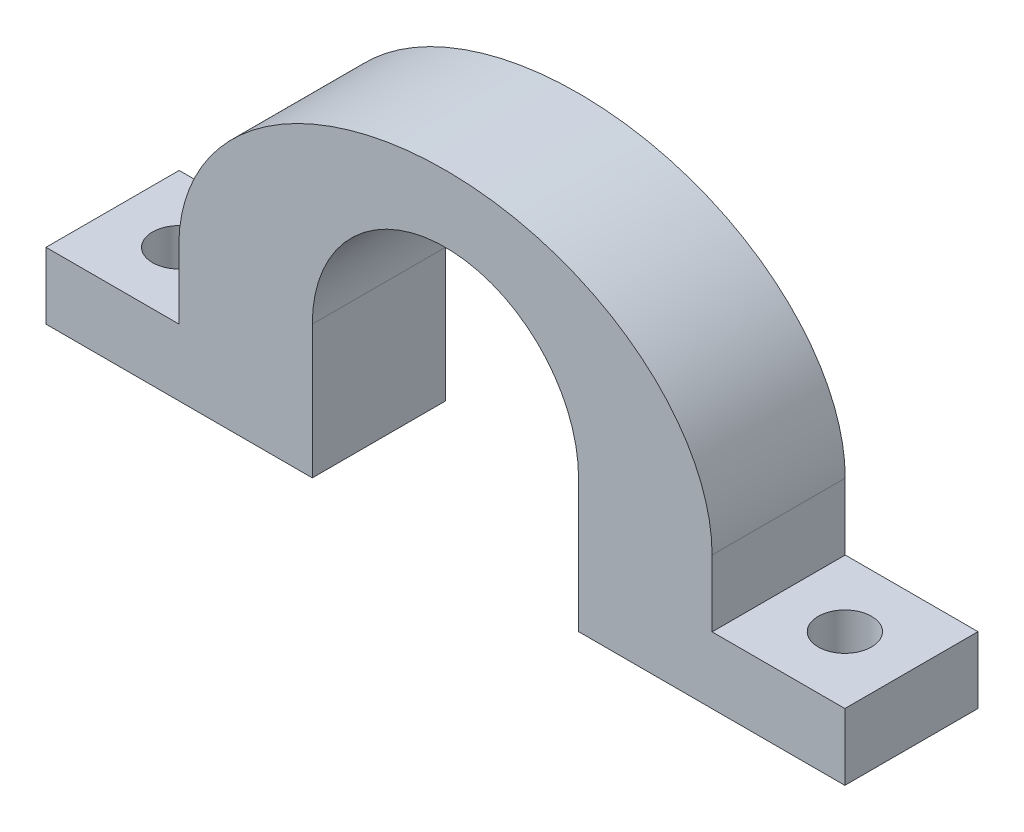
ISO-10303-21;
HEADER;
FILE_DESCRIPTION(('STEP AP214'),'2;1');
FILE_NAME('part.step','',(''),(''),'','','');
FILE_SCHEMA(('AUTOMOTIVE_DESIGN { 1 0 10303 214 1 1 1 1 }'));
ENDSEC;
DATA;
#1=APPLICATION_CONTEXT('core data for automotive mechanical design processes');
#2=APPLICATION_PROTOCOL_DEFINITION('international standard','automotive_design',2000,#1);
#3=PRODUCT_CONTEXT('',#1,'mechanical');
#4=PRODUCT('Part','Part','',(#3));
#5=PRODUCT_RELATED_PRODUCT_CATEGORY('part','',(#4));
#6=PRODUCT_DEFINITION_FORMATION('','',#4);
#7=PRODUCT_DEFINITION_CONTEXT('part definition',#1,'design');
#8=PRODUCT_DEFINITION('design','',#6,#7);
#9=PRODUCT_DEFINITION_SHAPE('','',#8);
#10=(LENGTH_UNIT() NAMED_UNIT(*) SI_UNIT(.MILLI.,.METRE.));
#11=(NAMED_UNIT(*) PLANE_ANGLE_UNIT() SI_UNIT($,.RADIAN.));
#12=(NAMED_UNIT(*) SI_UNIT($,.STERADIAN.) SOLID_ANGLE_UNIT());
#13=UNCERTAINTY_MEASURE_WITH_UNIT(LENGTH_MEASURE(1.E-05),#10,'distance_accuracy_value','');
#14=(GEOMETRIC_REPRESENTATION_CONTEXT(3) GLOBAL_UNCERTAINTY_ASSIGNED_CONTEXT((#13)) GLOBAL_UNIT_ASSIGNED_CONTEXT((#10,
#11,#12)) REPRESENTATION_CONTEXT('',''));
#15=CARTESIAN_POINT('',(0.,0.,0.));
#16=DIRECTION('',(0.,0.,1.));
#17=DIRECTION('',(1.,0.,0.));
#18=AXIS2_PLACEMENT_3D('',#15,#16,#17);
#19=CARTESIAN_POINT('',(0.,-10.,10.));
#20=DIRECTION('',(0.,-1.,0.));
#21=DIRECTION('',(0.,0.,-1.));
#22=AXIS2_PLACEMENT_3D('',#19,#20,#21);
#23=PLANE('',#22);
#24=CARTESIAN_POINT('',(-25.,-10.,5.));
#25=DIRECTION('',(0.,1.,0.));
#26=DIRECTION('',(0.,0.,1.));
#27=AXIS2_PLACEMENT_3D('',#24,#25,#26);
#28=CIRCLE('',#27,2.);
#29=CARTESIAN_POINT('',(-25.,-10.,7.));
#30=VERTEX_POINT('',#29);
#31=EDGE_CURVE('E154',#30,#30,#28,.T.);
#32=ORIENTED_EDGE('',*,*,#31,.T.);
#33=EDGE_LOOP('',(#32));
#34=FACE_BOUND('',#33,.T.);
#35=DIRECTION('',(-1.,0.,0.));
#36=VECTOR('',#35,1.);
#37=CARTESIAN_POINT('',(0.,-10.,0.));
#38=LINE('',#37,#36);
#39=CARTESIAN_POINT('',(-10.,-10.,0.));
#40=VERTEX_POINT('',#39);
#41=CARTESIAN_POINT('',(-30.,-10.,0.));
#42=VERTEX_POINT('',#41);
#43=EDGE_CURVE('E151',#40,#42,#38,.T.);
#44=ORIENTED_EDGE('',*,*,#43,.F.);
#45=DIRECTION('',(0.,0.,-1.));
#46=VECTOR('',#45,1.);
#47=CARTESIAN_POINT('',(-10.,-10.,10.));
#48=LINE('',#47,#46);
#49=CARTESIAN_POINT('',(-10.,-10.,10.));
#50=VERTEX_POINT('',#49);
#51=EDGE_CURVE('E11',#50,#40,#48,.T.);
#52=ORIENTED_EDGE('',*,*,#51,.F.);
#53=DIRECTION('',(-1.,0.,0.));
#54=VECTOR('',#53,1.);
#55=CARTESIAN_POINT('',(0.,-10.,10.));
#56=LINE('',#55,#54);
#57=CARTESIAN_POINT('',(-30.,-10.,10.));
#58=VERTEX_POINT('',#57);
#59=EDGE_CURVE('E181',#50,#58,#56,.T.);
#60=ORIENTED_EDGE('',*,*,#59,.T.);
#61=DIRECTION('',(0.,0.,-1.));
#62=VECTOR('',#61,1.);
#63=CARTESIAN_POINT('',(-30.,-10.,10.));
#64=LINE('',#63,#62);
#65=EDGE_CURVE('E51',#58,#42,#64,.T.);
#66=ORIENTED_EDGE('',*,*,#65,.T.);
#67=EDGE_LOOP('',(#44,#52,#60,#66));
#68=FACE_BOUND('',#67,.T.);
#69=ADVANCED_FACE('F35',(#34,#68),#23,.T.);
#70=CARTESIAN_POINT('',(-10.,0.,10.));
#71=DIRECTION('',(1.,0.,0.));
#72=DIRECTION('',(0.,1.,0.));
#73=AXIS2_PLACEMENT_3D('',#70,#71,#72);
#74=PLANE('',#73);
#75=DIRECTION('',(0.,-1.,0.));
#76=VECTOR('',#75,1.);
#77=CARTESIAN_POINT('',(-10.,0.,0.));
#78=LINE('',#77,#76);
#79=CARTESIAN_POINT('',(-10.,0.,0.));
#80=VERTEX_POINT('',#79);
#81=EDGE_CURVE('E153',#80,#40,#78,.T.);
#82=ORIENTED_EDGE('',*,*,#81,.F.);
#83=DIRECTION('',(0.,0.,-1.));
#84=VECTOR('',#83,1.);
#85=CARTESIAN_POINT('',(-10.,0.,10.));
#86=LINE('',#85,#84);
#87=CARTESIAN_POINT('',(-10.,0.,10.));
#88=VERTEX_POINT('',#87);
#89=EDGE_CURVE('E43',#88,#80,#86,.T.);
#90=ORIENTED_EDGE('',*,*,#89,.F.);
#91=DIRECTION('',(0.,-1.,0.));
#92=VECTOR('',#91,1.);
#93=CARTESIAN_POINT('',(-10.,0.,10.));
#94=LINE('',#93,#92);
#95=EDGE_CURVE('E306',#88,#50,#94,.T.);
#96=ORIENTED_EDGE('',*,*,#95,.T.);
#97=ORIENTED_EDGE('',*,*,#51,.T.);
#98=EDGE_LOOP('',(#82,#90,#96,#97));
#99=FACE_BOUND('',#98,.T.);
#100=ADVANCED_FACE('F209',(#99),#74,.T.);
#101=CARTESIAN_POINT('',(0.,0.,10.));
#102=DIRECTION('',(0.,0.,-1.));
#103=DIRECTION('',(-1.,0.,0.));
#104=AXIS2_PLACEMENT_3D('',#101,#102,#103);
#105=CYLINDRICAL_SURFACE('',#104,10.);
#106=CARTESIAN_POINT('',(0.,0.,0.));
#107=DIRECTION('',(0.,0.,1.));
#108=DIRECTION('',(1.,0.,0.));
#109=AXIS2_PLACEMENT_3D('',#106,#107,#108);
#110=CIRCLE('',#109,10.);
#111=CARTESIAN_POINT('',(10.,0.,0.));
#112=VERTEX_POINT('',#111);
#113=EDGE_CURVE('E157',#112,#80,#110,.T.);
#114=ORIENTED_EDGE('',*,*,#113,.F.);
#115=DIRECTION('',(0.,0.,-1.));
#116=VECTOR('',#115,1.);
#117=CARTESIAN_POINT('',(10.,0.,10.));
#118=LINE('',#117,#116);
#119=CARTESIAN_POINT('',(10.,0.,10.));
#120=VERTEX_POINT('',#119);
#121=EDGE_CURVE('E198',#120,#112,#118,.T.);
#122=ORIENTED_EDGE('',*,*,#121,.F.);
#123=CARTESIAN_POINT('',(0.,0.,10.));
#124=DIRECTION('',(0.,0.,1.));
#125=DIRECTION('',(1.,0.,0.));
#126=AXIS2_PLACEMENT_3D('',#123,#124,#125);
#127=CIRCLE('',#126,10.);
#128=EDGE_CURVE('E205',#120,#88,#127,.T.);
#129=ORIENTED_EDGE('',*,*,#128,.T.);
#130=ORIENTED_EDGE('',*,*,#89,.T.);
#131=EDGE_LOOP('',(#114,#122,#129,#130));
#132=FACE_BOUND('',#131,.T.);
#133=ADVANCED_FACE('F203',(#132),#105,.F.);
#134=CARTESIAN_POINT('',(10.,0.,10.));
#135=DIRECTION('',(1.,0.,0.));
#136=DIRECTION('',(0.,1.,0.));
#137=AXIS2_PLACEMENT_3D('',#134,#135,#136);
#138=PLANE('',#137);
#139=DIRECTION('',(0.,-1.,0.));
#140=VECTOR('',#139,1.);
#141=CARTESIAN_POINT('',(10.,0.,0.));
#142=LINE('',#141,#140);
#143=CARTESIAN_POINT('',(10.,-10.,0.));
#144=VERTEX_POINT('',#143);
#145=EDGE_CURVE('E160',#112,#144,#142,.T.);
#146=ORIENTED_EDGE('',*,*,#145,.T.);
#147=DIRECTION('',(0.,0.,-1.));
#148=VECTOR('',#147,1.);
#149=CARTESIAN_POINT('',(10.,-10.,10.));
#150=LINE('',#149,#148);
#151=CARTESIAN_POINT('',(10.,-10.,10.));
#152=VERTEX_POINT('',#151);
#153=EDGE_CURVE('E195',#152,#144,#150,.T.);
#154=ORIENTED_EDGE('',*,*,#153,.F.);
#155=DIRECTION('',(0.,-1.,0.));
#156=VECTOR('',#155,1.);
#157=CARTESIAN_POINT('',(10.,0.,10.));
#158=LINE('',#157,#156);
#159=EDGE_CURVE('E226',#120,#152,#158,.T.);
#160=ORIENTED_EDGE('',*,*,#159,.F.);
#161=ORIENTED_EDGE('',*,*,#121,.T.);
#162=EDGE_LOOP('',(#146,#154,#160,#161));
#163=FACE_BOUND('',#162,.T.);
#164=ADVANCED_FACE('F216',(#163),#138,.F.);
#165=CARTESIAN_POINT('',(0.,-10.,10.));
#166=DIRECTION('',(0.,1.,0.));
#167=DIRECTION('',(-1.,0.,0.));
#168=AXIS2_PLACEMENT_3D('',#165,#166,#167);
#169=PLANE('',#168);
#170=CARTESIAN_POINT('',(25.,-10.,5.));
#171=DIRECTION('',(0.,1.,0.));
#172=DIRECTION('',(0.,0.,1.));
#173=AXIS2_PLACEMENT_3D('',#170,#171,#172);
#174=CIRCLE('',#173,2.);
#175=CARTESIAN_POINT('',(25.,-10.,7.));
#176=VERTEX_POINT('',#175);
#177=EDGE_CURVE('E294',#176,#176,#174,.T.);
#178=ORIENTED_EDGE('',*,*,#177,.T.);
#179=EDGE_LOOP('',(#178));
#180=FACE_BOUND('',#179,.T.);
#181=DIRECTION('',(1.,0.,0.));
#182=VECTOR('',#181,1.);
#183=CARTESIAN_POINT('',(0.,-10.,0.));
#184=LINE('',#183,#182);
#185=CARTESIAN_POINT('',(30.,-10.,0.));
#186=VERTEX_POINT('',#185);
#187=EDGE_CURVE('E162',#144,#186,#184,.T.);
#188=ORIENTED_EDGE('',*,*,#187,.T.);
#189=DIRECTION('',(0.,0.,-1.));
#190=VECTOR('',#189,1.);
#191=CARTESIAN_POINT('',(30.,-10.,10.));
#192=LINE('',#191,#190);
#193=CARTESIAN_POINT('',(30.,-10.,10.));
#194=VERTEX_POINT('',#193);
#195=EDGE_CURVE('E193',#194,#186,#192,.T.);
#196=ORIENTED_EDGE('',*,*,#195,.F.);
#197=DIRECTION('',(1.,0.,0.));
#198=VECTOR('',#197,1.);
#199=CARTESIAN_POINT('',(0.,-10.,10.));
#200=LINE('',#199,#198);
#201=EDGE_CURVE('E222',#152,#194,#200,.T.);
#202=ORIENTED_EDGE('',*,*,#201,.F.);
#203=ORIENTED_EDGE('',*,*,#153,.T.);
#204=EDGE_LOOP('',(#188,#196,#202,#203));
#205=FACE_BOUND('',#204,.T.);
#206=ADVANCED_FACE('F220',(#180,#205),#169,.F.);
#207=CARTESIAN_POINT('',(30.,0.,10.));
#208=DIRECTION('',(1.,0.,0.));
#209=DIRECTION('',(0.,0.,-1.));
#210=AXIS2_PLACEMENT_3D('',#207,#208,#209);
#211=PLANE('',#210);
#212=DIRECTION('',(0.,-1.,0.));
#213=VECTOR('',#212,1.);
#214=CARTESIAN_POINT('',(30.,0.,0.));
#215=LINE('',#214,#213);
#216=CARTESIAN_POINT('',(30.,-5.,0.));
#217=VERTEX_POINT('',#216);
#218=EDGE_CURVE('E165',#217,#186,#215,.T.);
#219=ORIENTED_EDGE('',*,*,#218,.F.);
#220=DIRECTION('',(0.,0.,-1.));
#221=VECTOR('',#220,1.);
#222=CARTESIAN_POINT('',(30.,-5.,10.));
#223=LINE('',#222,#221);
#224=CARTESIAN_POINT('',(30.,-5.,10.));
#225=VERTEX_POINT('',#224);
#226=EDGE_CURVE('E191',#225,#217,#223,.T.);
#227=ORIENTED_EDGE('',*,*,#226,.F.);
#228=DIRECTION('',(0.,-1.,0.));
#229=VECTOR('',#228,1.);
#230=CARTESIAN_POINT('',(30.,0.,10.));
#231=LINE('',#230,#229);
#232=EDGE_CURVE('E225',#225,#194,#231,.T.);
#233=ORIENTED_EDGE('',*,*,#232,.T.);
#234=ORIENTED_EDGE('',*,*,#195,.T.);
#235=EDGE_LOOP('',(#219,#227,#233,#234));
#236=FACE_BOUND('',#235,.T.);
#237=ADVANCED_FACE('F250',(#236),#211,.T.);
#238=CARTESIAN_POINT('',(0.,-5.,10.));
#239=DIRECTION('',(0.,-1.,0.));
#240=DIRECTION('',(1.,0.,0.));
#241=AXIS2_PLACEMENT_3D('',#238,#239,#240);
#242=PLANE('',#241);
#243=CARTESIAN_POINT('',(25.,-5.,5.));
#244=DIRECTION('',(0.,1.,0.));
#245=DIRECTION('',(0.,0.,1.));
#246=AXIS2_PLACEMENT_3D('',#243,#244,#245);
#247=CIRCLE('',#246,2.);
#248=CARTESIAN_POINT('',(25.,-5.,7.));
#249=VERTEX_POINT('',#248);
#250=EDGE_CURVE('E297',#249,#249,#247,.T.);
#251=ORIENTED_EDGE('',*,*,#250,.F.);
#252=EDGE_LOOP('',(#251));
#253=FACE_BOUND('',#252,.T.);
#254=DIRECTION('',(-1.,0.,0.));
#255=VECTOR('',#254,1.);
#256=CARTESIAN_POINT('',(0.,-5.,0.));
#257=LINE('',#256,#255);
#258=CARTESIAN_POINT('',(20.0292286671907,-5.,0.));
#259=VERTEX_POINT('',#258);
#260=EDGE_CURVE('E168',#217,#259,#257,.T.);
#261=ORIENTED_EDGE('',*,*,#260,.T.);
#262=DIRECTION('',(0.,0.,-1.));
#263=VECTOR('',#262,1.);
#264=CARTESIAN_POINT('',(20.0292286671907,-5.,10.));
#265=LINE('',#264,#263);
#266=CARTESIAN_POINT('',(20.0292286671907,-5.,10.));
#267=VERTEX_POINT('',#266);
#268=EDGE_CURVE('E188',#267,#259,#265,.T.);
#269=ORIENTED_EDGE('',*,*,#268,.F.);
#270=DIRECTION('',(-1.,0.,0.));
#271=VECTOR('',#270,1.);
#272=CARTESIAN_POINT('',(0.,-5.,10.));
#273=LINE('',#272,#271);
#274=EDGE_CURVE('E228',#225,#267,#273,.T.);
#275=ORIENTED_EDGE('',*,*,#274,.F.);
#276=ORIENTED_EDGE('',*,*,#226,.T.);
#277=EDGE_LOOP('',(#261,#269,#275,#276));
#278=FACE_BOUND('',#277,.T.);
#279=ADVANCED_FACE('F246',(#253,#278),#242,.F.);
#280=CARTESIAN_POINT('',(20.0292286671907,0.,10.));
#281=DIRECTION('',(-1.,0.,0.));
#282=DIRECTION('',(0.,0.,1.));
#283=AXIS2_PLACEMENT_3D('',#280,#281,#282);
#284=PLANE('',#283);
#285=DIRECTION('',(0.,1.,0.));
#286=VECTOR('',#285,1.);
#287=CARTESIAN_POINT('',(20.0292286671907,0.,0.));
#288=LINE('',#287,#286);
#289=CARTESIAN_POINT('',(20.0292286671907,0.,0.));
#290=VERTEX_POINT('',#289);
#291=EDGE_CURVE('E170',#259,#290,#288,.T.);
#292=ORIENTED_EDGE('',*,*,#291,.T.);
#293=DIRECTION('',(0.,0.,-1.));
#294=VECTOR('',#293,1.);
#295=CARTESIAN_POINT('',(20.0292286671907,0.,10.));
#296=LINE('',#295,#294);
#297=CARTESIAN_POINT('',(20.0292286671907,0.,10.));
#298=VERTEX_POINT('',#297);
#299=EDGE_CURVE('E185',#298,#290,#296,.T.);
#300=ORIENTED_EDGE('',*,*,#299,.F.);
#301=DIRECTION('',(0.,1.,0.));
#302=VECTOR('',#301,1.);
#303=CARTESIAN_POINT('',(20.0292286671907,0.,10.));
#304=LINE('',#303,#302);
#305=EDGE_CURVE('E234',#267,#298,#304,.T.);
#306=ORIENTED_EDGE('',*,*,#305,.F.);
#307=ORIENTED_EDGE('',*,*,#268,.T.);
#308=EDGE_LOOP('',(#292,#300,#306,#307));
#309=FACE_BOUND('',#308,.T.);
#310=ADVANCED_FACE('F241',(#309),#284,.F.);
#311=CARTESIAN_POINT('',(0.,0.,10.));
#312=DIRECTION('',(0.,0.,1.));
#313=DIRECTION('',(1.,0.,0.));
#314=AXIS2_PLACEMENT_3D('',#311,#312,#313);
#315=ELLIPSE('',#314,20.0292286671907,15.021921500393);
#316=DIRECTION('',(0.,0.,-1.));
#317=VECTOR('',#316,1.);
#318=SURFACE_OF_LINEAR_EXTRUSION('',#315,#317);
#319=CARTESIAN_POINT('',(0.,0.,0.));
#320=DIRECTION('',(0.,0.,1.));
#321=DIRECTION('',(1.,0.,0.));
#322=AXIS2_PLACEMENT_3D('',#319,#320,#321);
#323=ELLIPSE('',#322,20.0292286671907,15.021921500393);
#324=CARTESIAN_POINT('',(-20.,-0.811249384572979,0.));
#325=VERTEX_POINT('',#324);
#326=EDGE_CURVE('E172',#290,#325,#323,.T.);
#327=ORIENTED_EDGE('',*,*,#326,.T.);
#328=DIRECTION('',(0.,0.,-1.));
#329=VECTOR('',#328,1.);
#330=CARTESIAN_POINT('',(-20.,-0.811249384572979,10.));
#331=LINE('',#330,#329);
#332=CARTESIAN_POINT('',(-20.,-0.811249384572979,10.));
#333=VERTEX_POINT('',#332);
#334=EDGE_CURVE('E134',#333,#325,#331,.T.);
#335=ORIENTED_EDGE('',*,*,#334,.F.);
#336=EDGE_CURVE('E142',#298,#333,#315,.T.);
#337=ORIENTED_EDGE('',*,*,#336,.F.);
#338=ORIENTED_EDGE('',*,*,#299,.T.);
#339=EDGE_LOOP('',(#327,#335,#337,#338));
#340=FACE_BOUND('',#339,.T.);
#341=ADVANCED_FACE('F237',(#340),#318,.F.);
#342=CARTESIAN_POINT('',(-20.,0.,10.));
#343=DIRECTION('',(-1.,0.,0.));
#344=DIRECTION('',(0.,0.,1.));
#345=AXIS2_PLACEMENT_3D('',#342,#343,#344);
#346=PLANE('',#345);
#347=DIRECTION('',(0.,1.,0.));
#348=VECTOR('',#347,1.);
#349=CARTESIAN_POINT('',(-20.,0.,0.));
#350=LINE('',#349,#348);
#351=CARTESIAN_POINT('',(-20.,-5.,0.));
#352=VERTEX_POINT('',#351);
#353=EDGE_CURVE('E130',#352,#325,#350,.T.);
#354=ORIENTED_EDGE('',*,*,#353,.F.);
#355=DIRECTION('',(0.,0.,-1.));
#356=VECTOR('',#355,1.);
#357=CARTESIAN_POINT('',(-20.,-5.,10.));
#358=LINE('',#357,#356);
#359=CARTESIAN_POINT('',(-20.,-5.,10.));
#360=VERTEX_POINT('',#359);
#361=EDGE_CURVE('E125',#360,#352,#358,.T.);
#362=ORIENTED_EDGE('',*,*,#361,.F.);
#363=DIRECTION('',(0.,1.,0.));
#364=VECTOR('',#363,1.);
#365=CARTESIAN_POINT('',(-20.,0.,10.));
#366=LINE('',#365,#364);
#367=EDGE_CURVE('E128',#360,#333,#366,.T.);
#368=ORIENTED_EDGE('',*,*,#367,.T.);
#369=ORIENTED_EDGE('',*,*,#334,.T.);
#370=EDGE_LOOP('',(#354,#362,#368,#369));
#371=FACE_BOUND('',#370,.T.);
#372=ADVANCED_FACE('F127',(#371),#346,.T.);
#373=CARTESIAN_POINT('',(0.,-5.,10.));
#374=DIRECTION('',(0.,1.,0.));
#375=DIRECTION('',(0.,0.,1.));
#376=AXIS2_PLACEMENT_3D('',#373,#374,#375);
#377=PLANE('',#376);
#378=CARTESIAN_POINT('',(-25.,-5.,5.));
#379=DIRECTION('',(0.,1.,0.));
#380=DIRECTION('',(0.,0.,1.));
#381=AXIS2_PLACEMENT_3D('',#378,#379,#380);
#382=CIRCLE('',#381,2.);
#383=CARTESIAN_POINT('',(-25.,-5.,7.));
#384=VERTEX_POINT('',#383);
#385=EDGE_CURVE('E299',#384,#384,#382,.T.);
#386=ORIENTED_EDGE('',*,*,#385,.F.);
#387=EDGE_LOOP('',(#386));
#388=FACE_BOUND('',#387,.T.);
#389=DIRECTION('',(1.,0.,0.));
#390=VECTOR('',#389,1.);
#391=CARTESIAN_POINT('',(0.,-5.,0.));
#392=LINE('',#391,#390);
#393=CARTESIAN_POINT('',(-30.,-5.,0.));
#394=VERTEX_POINT('',#393);
#395=EDGE_CURVE('E176',#394,#352,#392,.T.);
#396=ORIENTED_EDGE('',*,*,#395,.F.);
#397=DIRECTION('',(0.,0.,-1.));
#398=VECTOR('',#397,1.);
#399=CARTESIAN_POINT('',(-30.,-5.,10.));
#400=LINE('',#399,#398);
#401=CARTESIAN_POINT('',(-30.,-5.,10.));
#402=VERTEX_POINT('',#401);
#403=EDGE_CURVE('E88',#402,#394,#400,.T.);
#404=ORIENTED_EDGE('',*,*,#403,.F.);
#405=DIRECTION('',(1.,0.,0.));
#406=VECTOR('',#405,1.);
#407=CARTESIAN_POINT('',(0.,-5.,10.));
#408=LINE('',#407,#406);
#409=EDGE_CURVE('E140',#402,#360,#408,.T.);
#410=ORIENTED_EDGE('',*,*,#409,.T.);
#411=ORIENTED_EDGE('',*,*,#361,.T.);
#412=EDGE_LOOP('',(#396,#404,#410,#411));
#413=FACE_BOUND('',#412,.T.);
#414=ADVANCED_FACE('F145',(#388,#413),#377,.T.);
#415=CARTESIAN_POINT('',(-30.,0.,10.));
#416=DIRECTION('',(-1.,0.,0.));
#417=DIRECTION('',(0.,0.,1.));
#418=AXIS2_PLACEMENT_3D('',#415,#416,#417);
#419=PLANE('',#418);
#420=DIRECTION('',(0.,1.,0.));
#421=VECTOR('',#420,1.);
#422=CARTESIAN_POINT('',(-30.,0.,0.));
#423=LINE('',#422,#421);
#424=EDGE_CURVE('E178',#42,#394,#423,.T.);
#425=ORIENTED_EDGE('',*,*,#424,.F.);
#426=ORIENTED_EDGE('',*,*,#65,.F.);
#427=DIRECTION('',(0.,1.,0.));
#428=VECTOR('',#427,1.);
#429=CARTESIAN_POINT('',(-30.,0.,10.));
#430=LINE('',#429,#428);
#431=EDGE_CURVE('E146',#58,#402,#430,.T.);
#432=ORIENTED_EDGE('',*,*,#431,.T.);
#433=ORIENTED_EDGE('',*,*,#403,.T.);
#434=EDGE_LOOP('',(#425,#426,#432,#433));
#435=FACE_BOUND('',#434,.T.);
#436=ADVANCED_FACE('F270',(#435),#419,.T.);
#437=CARTESIAN_POINT('',(0.,0.,10.));
#438=DIRECTION('',(0.,0.,1.));
#439=DIRECTION('',(1.,0.,0.));
#440=AXIS2_PLACEMENT_3D('',#437,#438,#439);
#441=PLANE('',#440);
#442=ORIENTED_EDGE('',*,*,#59,.F.);
#443=ORIENTED_EDGE('',*,*,#95,.F.);
#444=ORIENTED_EDGE('',*,*,#128,.F.);
#445=ORIENTED_EDGE('',*,*,#159,.T.);
#446=ORIENTED_EDGE('',*,*,#201,.T.);
#447=ORIENTED_EDGE('',*,*,#232,.F.);
#448=ORIENTED_EDGE('',*,*,#274,.T.);
#449=ORIENTED_EDGE('',*,*,#305,.T.);
#450=ORIENTED_EDGE('',*,*,#336,.T.);
#451=ORIENTED_EDGE('',*,*,#367,.F.);
#452=ORIENTED_EDGE('',*,*,#409,.F.);
#453=ORIENTED_EDGE('',*,*,#431,.F.);
#454=EDGE_LOOP('',(#442,#443,#444,#445,#446,#447,#448,#449,#450,#451,#452,#453));
#455=FACE_BOUND('',#454,.T.);
#456=ADVANCED_FACE('F138',(#455),#441,.T.);
#457=CARTESIAN_POINT('',(0.,0.,0.));
#458=DIRECTION('',(0.,0.,1.));
#459=DIRECTION('',(1.,0.,0.));
#460=AXIS2_PLACEMENT_3D('',#457,#458,#459);
#461=PLANE('',#460);
#462=ORIENTED_EDGE('',*,*,#43,.T.);
#463=ORIENTED_EDGE('',*,*,#424,.T.);
#464=ORIENTED_EDGE('',*,*,#395,.T.);
#465=ORIENTED_EDGE('',*,*,#353,.T.);
#466=ORIENTED_EDGE('',*,*,#326,.F.);
#467=ORIENTED_EDGE('',*,*,#291,.F.);
#468=ORIENTED_EDGE('',*,*,#260,.F.);
#469=ORIENTED_EDGE('',*,*,#218,.T.);
#470=ORIENTED_EDGE('',*,*,#187,.F.);
#471=ORIENTED_EDGE('',*,*,#145,.F.);
#472=ORIENTED_EDGE('',*,*,#113,.T.);
#473=ORIENTED_EDGE('',*,*,#81,.T.);
#474=EDGE_LOOP('',(#462,#463,#464,#465,#466,#467,#468,#469,#470,#471,#472,#473));
#475=FACE_BOUND('',#474,.T.);
#476=ADVANCED_FACE('F212',(#475),#461,.F.);
#477=CARTESIAN_POINT('',(-25.,-10.,5.));
#478=DIRECTION('',(0.,1.,0.));
#479=DIRECTION('',(0.,0.,1.));
#480=AXIS2_PLACEMENT_3D('',#477,#478,#479);
#481=CYLINDRICAL_SURFACE('',#480,2.);
#482=ORIENTED_EDGE('',*,*,#31,.F.);
#483=EDGE_LOOP('',(#482));
#484=FACE_BOUND('',#483,.T.);
#485=ORIENTED_EDGE('',*,*,#385,.T.);
#486=EDGE_LOOP('',(#485));
#487=FACE_BOUND('',#486,.T.);
#488=ADVANCED_FACE('F281',(#484,#487),#481,.F.);
#489=CARTESIAN_POINT('',(25.,-10.,5.));
#490=DIRECTION('',(0.,1.,0.));
#491=DIRECTION('',(0.,0.,1.));
#492=AXIS2_PLACEMENT_3D('',#489,#490,#491);
#493=CYLINDRICAL_SURFACE('',#492,2.);
#494=ORIENTED_EDGE('',*,*,#177,.F.);
#495=EDGE_LOOP('',(#494));
#496=FACE_BOUND('',#495,.T.);
#497=ORIENTED_EDGE('',*,*,#250,.T.);
#498=EDGE_LOOP('',(#497));
#499=FACE_BOUND('',#498,.T.);
#500=ADVANCED_FACE('F285',(#496,#499),#493,.F.);
#501=CLOSED_SHELL('',(#69,#100,#133,#164,#206,#237,#279,#310,#341,#372,#414,#436,#456,#476,#488,#500));
#502=MANIFOLD_SOLID_BREP('B2',#501);
#503=ADVANCED_BREP_SHAPE_REPRESENTATION('',(#18,#502),#14);
#504=SHAPE_DEFINITION_REPRESENTATION(#9,#503);
ENDSEC;
END-ISO-10303-21;
